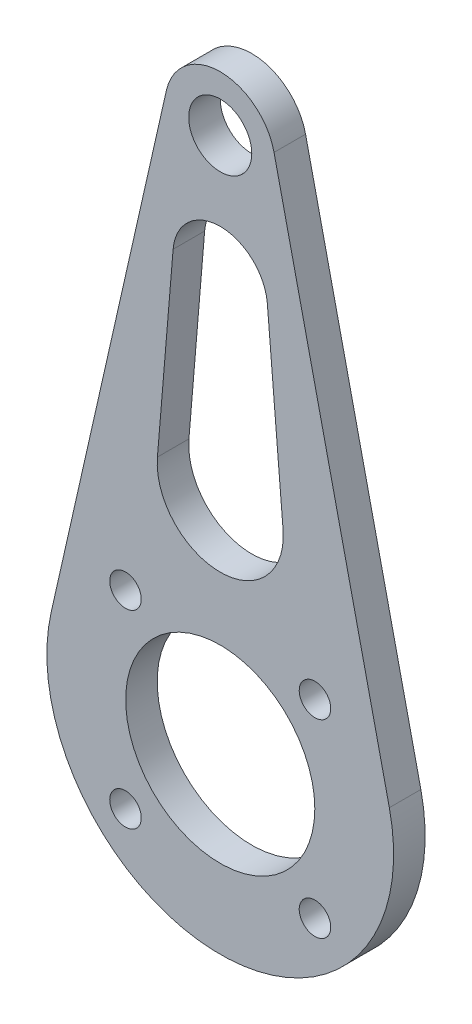
ISO-10303-21;
HEADER;
FILE_DESCRIPTION(('STEP AP214'),'2;1');
FILE_NAME('part.step','',(''),(''),'','','');
FILE_SCHEMA(('AUTOMOTIVE_DESIGN { 1 0 10303 214 1 1 1 1 }'));
ENDSEC;
DATA;
#1=APPLICATION_CONTEXT('core data for automotive mechanical design processes');
#2=APPLICATION_PROTOCOL_DEFINITION('international standard','automotive_design',2000,#1);
#3=PRODUCT_CONTEXT('',#1,'mechanical');
#4=PRODUCT('Part','Part','',(#3));
#5=PRODUCT_RELATED_PRODUCT_CATEGORY('part','',(#4));
#6=PRODUCT_DEFINITION_FORMATION('','',#4);
#7=PRODUCT_DEFINITION_CONTEXT('part definition',#1,'design');
#8=PRODUCT_DEFINITION('design','',#6,#7);
#9=PRODUCT_DEFINITION_SHAPE('','',#8);
#10=(LENGTH_UNIT() NAMED_UNIT(*) SI_UNIT(.MILLI.,.METRE.));
#11=(NAMED_UNIT(*) PLANE_ANGLE_UNIT() SI_UNIT($,.RADIAN.));
#12=(NAMED_UNIT(*) SI_UNIT($,.STERADIAN.) SOLID_ANGLE_UNIT());
#13=UNCERTAINTY_MEASURE_WITH_UNIT(LENGTH_MEASURE(1.E-05),#10,'distance_accuracy_value','');
#14=(GEOMETRIC_REPRESENTATION_CONTEXT(3) GLOBAL_UNCERTAINTY_ASSIGNED_CONTEXT((#13)) GLOBAL_UNIT_ASSIGNED_CONTEXT((#10,
#11,#12)) REPRESENTATION_CONTEXT('',''));
#15=CARTESIAN_POINT('',(0.,0.,0.));
#16=DIRECTION('',(0.,0.,1.));
#17=DIRECTION('',(1.,0.,0.));
#18=AXIS2_PLACEMENT_3D('',#15,#16,#17);
#19=CARTESIAN_POINT('',(-0.504931321829133,20.3713015086282,2.));
#20=DIRECTION('',(0.,0.,1.));
#21=DIRECTION('',(1.,0.,0.));
#22=AXIS2_PLACEMENT_3D('',#19,#20,#21);
#23=PLANE('',#22);
#24=CARTESIAN_POINT('',(-6.51533896191475,-19.6391061314575,2.));
#25=DIRECTION('',(0.,0.,1.));
#26=DIRECTION('',(0.,-1.,0.));
#27=AXIS2_PLACEMENT_3D('',#24,#25,#26);
#28=CIRCLE('',#27,0.999999999999995);
#29=CARTESIAN_POINT('',(-6.51533896191474,-20.6391061314575,2.));
#30=VERTEX_POINT('',#29);
#31=EDGE_CURVE('E258',#30,#30,#28,.T.);
#32=ORIENTED_EDGE('',*,*,#31,.F.);
#33=EDGE_LOOP('',(#32));
#34=FACE_BOUND('',#33,.T.);
#35=CARTESIAN_POINT('',(-6.51533896191476,-7.61829085128616,2.));
#36=DIRECTION('',(0.,0.,1.));
#37=DIRECTION('',(-1.,0.,0.));
#38=AXIS2_PLACEMENT_3D('',#35,#36,#37);
#39=CIRCLE('',#38,0.999999999999995);
#40=CARTESIAN_POINT('',(-7.51533896191475,-7.61829085128616,2.));
#41=VERTEX_POINT('',#40);
#42=EDGE_CURVE('E260',#41,#41,#39,.T.);
#43=ORIENTED_EDGE('',*,*,#42,.F.);
#44=EDGE_LOOP('',(#43));
#45=FACE_BOUND('',#44,.T.);
#46=CARTESIAN_POINT('',(5.50547631825653,-7.6182908512862,2.));
#47=DIRECTION('',(0.,0.,1.));
#48=DIRECTION('',(0.,1.,0.));
#49=AXIS2_PLACEMENT_3D('',#46,#47,#48);
#50=CIRCLE('',#49,0.999999999999995);
#51=CARTESIAN_POINT('',(5.50547631825652,-6.61829085128621,2.));
#52=VERTEX_POINT('',#51);
#53=EDGE_CURVE('E266',#52,#52,#50,.T.);
#54=ORIENTED_EDGE('',*,*,#53,.F.);
#55=EDGE_LOOP('',(#54));
#56=FACE_BOUND('',#55,.T.);
#57=CARTESIAN_POINT('',(5.50547631825649,-19.6391061314575,2.));
#58=DIRECTION('',(0.,0.,1.));
#59=DIRECTION('',(1.,0.,0.));
#60=AXIS2_PLACEMENT_3D('',#57,#58,#59);
#61=CIRCLE('',#60,0.999999999999995);
#62=CARTESIAN_POINT('',(6.50547631825649,-19.6391061314575,2.));
#63=VERTEX_POINT('',#62);
#64=EDGE_CURVE('E272',#63,#63,#61,.T.);
#65=ORIENTED_EDGE('',*,*,#64,.F.);
#66=EDGE_LOOP('',(#65));
#67=FACE_BOUND('',#66,.T.);
#68=DIRECTION('',(-0.0833333333333333,0.996521728591783,0.));
#69=VECTOR('',#68,1.);
#70=CARTESIAN_POINT('',(2.48463386394622,12.6213015086282,2.));
#71=LINE('',#70,#69);
#72=CARTESIAN_POINT('',(3.481155592538,0.704634841961488,2.));
#73=VERTEX_POINT('',#72);
#74=CARTESIAN_POINT('',(2.48463386394622,12.6213015086282,2.));
#75=VERTEX_POINT('',#74);
#76=EDGE_CURVE('E106',#73,#75,#71,.T.);
#77=ORIENTED_EDGE('',*,*,#76,.F.);
#78=CARTESIAN_POINT('',(-0.504931321829133,0.371301508628154,2.));
#79=DIRECTION('',(0.,0.,1.));
#80=DIRECTION('',(1.,0.,0.));
#81=AXIS2_PLACEMENT_3D('',#78,#79,#80);
#82=CIRCLE('',#81,4.);
#83=CARTESIAN_POINT('',(-4.49101823619627,0.704634841961488,2.));
#84=VERTEX_POINT('',#83);
#85=EDGE_CURVE('E98',#84,#73,#82,.T.);
#86=ORIENTED_EDGE('',*,*,#85,.F.);
#87=DIRECTION('',(-0.0833333333333335,-0.996521728591783,0.));
#88=VECTOR('',#87,1.);
#89=CARTESIAN_POINT('',(-3.49449650760448,12.6213015086282,2.));
#90=LINE('',#89,#88);
#91=CARTESIAN_POINT('',(-3.49449650760448,12.6213015086282,2.));
#92=VERTEX_POINT('',#91);
#93=EDGE_CURVE('E121',#92,#84,#90,.T.);
#94=ORIENTED_EDGE('',*,*,#93,.F.);
#95=CARTESIAN_POINT('',(-0.504931321829133,12.3713015086282,2.));
#96=DIRECTION('',(0.,0.,1.));
#97=DIRECTION('',(1.,0.,0.));
#98=AXIS2_PLACEMENT_3D('',#95,#96,#97);
#99=CIRCLE('',#98,3.);
#100=EDGE_CURVE('E119',#75,#92,#99,.T.);
#101=ORIENTED_EDGE('',*,*,#100,.F.);
#102=EDGE_LOOP('',(#77,#86,#94,#101));
#103=FACE_BOUND('',#102,.T.);
#104=CARTESIAN_POINT('',(-0.504931321829133,-13.6286984913718,2.));
#105=DIRECTION('',(0.,0.,1.));
#106=DIRECTION('',(1.,0.,0.));
#107=AXIS2_PLACEMENT_3D('',#104,#105,#106);
#108=CIRCLE('',#107,6.);
#109=CARTESIAN_POINT('',(5.49506867817087,-13.6286984913718,2.));
#110=VERTEX_POINT('',#109);
#111=EDGE_CURVE('E137',#110,#110,#108,.T.);
#112=ORIENTED_EDGE('',*,*,#111,.F.);
#113=EDGE_LOOP('',(#112));
#114=FACE_BOUND('',#113,.T.);
#115=CARTESIAN_POINT('',(-0.504931321829133,20.3713015086282,2.));
#116=DIRECTION('',(0.,0.,1.));
#117=DIRECTION('',(1.,0.,0.));
#118=AXIS2_PLACEMENT_3D('',#115,#116,#117);
#119=CIRCLE('',#118,3.5);
#120=CARTESIAN_POINT('',(2.90885326027478,21.1433603321576,2.));
#121=VERTEX_POINT('',#120);
#122=CARTESIAN_POINT('',(-3.91871590393304,21.1433603321576,2.));
#123=VERTEX_POINT('',#122);
#124=EDGE_CURVE('E143',#121,#123,#119,.T.);
#125=ORIENTED_EDGE('',*,*,#124,.T.);
#126=DIRECTION('',(-0.220588235294118,-0.975367023458261,0.));
#127=VECTOR('',#126,1.);
#128=CARTESIAN_POINT('',(-3.91871590393304,21.1433603321576,2.));
#129=LINE('',#128,#127);
#130=CARTESIAN_POINT('',(-11.23396857987,-11.2022279031366,2.));
#131=VERTEX_POINT('',#130);
#132=EDGE_CURVE('E146',#123,#131,#129,.T.);
#133=ORIENTED_EDGE('',*,*,#132,.T.);
#134=CARTESIAN_POINT('',(-0.504931321829133,-13.6286984913718,2.));
#135=DIRECTION('',(0.,0.,1.));
#136=DIRECTION('',(1.,0.,0.));
#137=AXIS2_PLACEMENT_3D('',#134,#135,#136);
#138=CIRCLE('',#137,11.);
#139=CARTESIAN_POINT('',(10.2241059362117,-11.2022279031366,2.));
#140=VERTEX_POINT('',#139);
#141=EDGE_CURVE('E149',#131,#140,#138,.T.);
#142=ORIENTED_EDGE('',*,*,#141,.T.);
#143=DIRECTION('',(-0.220588235294117,0.975367023458261,0.));
#144=VECTOR('',#143,1.);
#145=CARTESIAN_POINT('',(2.90885326027478,21.1433603321576,2.));
#146=LINE('',#145,#144);
#147=EDGE_CURVE('E151',#140,#121,#146,.T.);
#148=ORIENTED_EDGE('',*,*,#147,.T.);
#149=EDGE_LOOP('',(#125,#133,#142,#148));
#150=FACE_BOUND('',#149,.T.);
#151=CARTESIAN_POINT('',(-0.504931321829133,20.3713015086282,2.));
#152=DIRECTION('',(0.,0.,1.));
#153=DIRECTION('',(1.,0.,0.));
#154=AXIS2_PLACEMENT_3D('',#151,#152,#153);
#155=CIRCLE('',#154,2.);
#156=CARTESIAN_POINT('',(1.49506867817087,20.3713015086282,2.));
#157=VERTEX_POINT('',#156);
#158=EDGE_CURVE('E127',#157,#157,#155,.T.);
#159=ORIENTED_EDGE('',*,*,#158,.F.);
#160=EDGE_LOOP('',(#159));
#161=FACE_BOUND('',#160,.T.);
#162=ADVANCED_FACE('F33',(#34,#45,#56,#67,#103,#114,#150,#161),#23,.T.);
#163=CARTESIAN_POINT('',(-0.504931321829133,20.3713015086282,0.));
#164=DIRECTION('',(0.,0.,1.));
#165=DIRECTION('',(1.,0.,0.));
#166=AXIS2_PLACEMENT_3D('',#163,#164,#165);
#167=PLANE('',#166);
#168=CARTESIAN_POINT('',(-6.51533896191475,-19.6391061314575,0.));
#169=DIRECTION('',(0.,0.,1.));
#170=DIRECTION('',(0.,-1.,0.));
#171=AXIS2_PLACEMENT_3D('',#168,#169,#170);
#172=CIRCLE('',#171,0.999999999999995);
#173=CARTESIAN_POINT('',(-6.51533896191474,-20.6391061314575,0.));
#174=VERTEX_POINT('',#173);
#175=EDGE_CURVE('E256',#174,#174,#172,.T.);
#176=ORIENTED_EDGE('',*,*,#175,.T.);
#177=EDGE_LOOP('',(#176));
#178=FACE_BOUND('',#177,.T.);
#179=CARTESIAN_POINT('',(-6.51533896191476,-7.61829085128616,0.));
#180=DIRECTION('',(0.,0.,1.));
#181=DIRECTION('',(-1.,0.,0.));
#182=AXIS2_PLACEMENT_3D('',#179,#180,#181);
#183=CIRCLE('',#182,0.999999999999995);
#184=CARTESIAN_POINT('',(-7.51533896191475,-7.61829085128616,0.));
#185=VERTEX_POINT('',#184);
#186=EDGE_CURVE('E263',#185,#185,#183,.T.);
#187=ORIENTED_EDGE('',*,*,#186,.T.);
#188=EDGE_LOOP('',(#187));
#189=FACE_BOUND('',#188,.T.);
#190=CARTESIAN_POINT('',(5.50547631825653,-7.6182908512862,0.));
#191=DIRECTION('',(0.,0.,1.));
#192=DIRECTION('',(0.,1.,0.));
#193=AXIS2_PLACEMENT_3D('',#190,#191,#192);
#194=CIRCLE('',#193,0.999999999999995);
#195=CARTESIAN_POINT('',(5.50547631825652,-6.61829085128621,0.));
#196=VERTEX_POINT('',#195);
#197=EDGE_CURVE('E269',#196,#196,#194,.T.);
#198=ORIENTED_EDGE('',*,*,#197,.T.);
#199=EDGE_LOOP('',(#198));
#200=FACE_BOUND('',#199,.T.);
#201=CARTESIAN_POINT('',(5.50547631825649,-19.6391061314575,0.));
#202=DIRECTION('',(0.,0.,1.));
#203=DIRECTION('',(1.,0.,0.));
#204=AXIS2_PLACEMENT_3D('',#201,#202,#203);
#205=CIRCLE('',#204,0.999999999999995);
#206=CARTESIAN_POINT('',(6.50547631825649,-19.6391061314575,0.));
#207=VERTEX_POINT('',#206);
#208=EDGE_CURVE('E275',#207,#207,#205,.T.);
#209=ORIENTED_EDGE('',*,*,#208,.T.);
#210=EDGE_LOOP('',(#209));
#211=FACE_BOUND('',#210,.T.);
#212=CARTESIAN_POINT('',(-0.504931321829133,-13.6286984913718,0.));
#213=DIRECTION('',(0.,0.,1.));
#214=DIRECTION('',(1.,0.,0.));
#215=AXIS2_PLACEMENT_3D('',#212,#213,#214);
#216=CIRCLE('',#215,6.);
#217=CARTESIAN_POINT('',(5.49506867817087,-13.6286984913718,0.));
#218=VERTEX_POINT('',#217);
#219=EDGE_CURVE('E114',#218,#218,#216,.T.);
#220=ORIENTED_EDGE('',*,*,#219,.T.);
#221=EDGE_LOOP('',(#220));
#222=FACE_BOUND('',#221,.T.);
#223=CARTESIAN_POINT('',(-0.504931321829133,20.3713015086282,0.));
#224=DIRECTION('',(0.,0.,1.));
#225=DIRECTION('',(1.,0.,0.));
#226=AXIS2_PLACEMENT_3D('',#223,#224,#225);
#227=CIRCLE('',#226,3.5);
#228=CARTESIAN_POINT('',(2.90885326027478,21.1433603321576,0.));
#229=VERTEX_POINT('',#228);
#230=CARTESIAN_POINT('',(-3.91871590393304,21.1433603321576,0.));
#231=VERTEX_POINT('',#230);
#232=EDGE_CURVE('E140',#229,#231,#227,.T.);
#233=ORIENTED_EDGE('',*,*,#232,.F.);
#234=DIRECTION('',(-0.220588235294117,0.975367023458261,0.));
#235=VECTOR('',#234,1.);
#236=CARTESIAN_POINT('',(2.90885326027478,21.1433603321576,0.));
#237=LINE('',#236,#235);
#238=CARTESIAN_POINT('',(10.2241059362117,-11.2022279031366,0.));
#239=VERTEX_POINT('',#238);
#240=EDGE_CURVE('E147',#239,#229,#237,.T.);
#241=ORIENTED_EDGE('',*,*,#240,.F.);
#242=CARTESIAN_POINT('',(-0.504931321829133,-13.6286984913718,0.));
#243=DIRECTION('',(0.,0.,1.));
#244=DIRECTION('',(1.,0.,0.));
#245=AXIS2_PLACEMENT_3D('',#242,#243,#244);
#246=CIRCLE('',#245,11.);
#247=CARTESIAN_POINT('',(-11.23396857987,-11.2022279031366,0.));
#248=VERTEX_POINT('',#247);
#249=EDGE_CURVE('E158',#248,#239,#246,.T.);
#250=ORIENTED_EDGE('',*,*,#249,.F.);
#251=DIRECTION('',(-0.220588235294118,-0.975367023458261,0.));
#252=VECTOR('',#251,1.);
#253=CARTESIAN_POINT('',(-3.91871590393304,21.1433603321576,0.));
#254=LINE('',#253,#252);
#255=EDGE_CURVE('E156',#231,#248,#254,.T.);
#256=ORIENTED_EDGE('',*,*,#255,.F.);
#257=EDGE_LOOP('',(#233,#241,#250,#256));
#258=FACE_BOUND('',#257,.T.);
#259=CARTESIAN_POINT('',(-0.504931321829133,0.371301508628154,0.));
#260=DIRECTION('',(0.,0.,1.));
#261=DIRECTION('',(1.,0.,0.));
#262=AXIS2_PLACEMENT_3D('',#259,#260,#261);
#263=CIRCLE('',#262,4.);
#264=CARTESIAN_POINT('',(-4.49101823619627,0.704634841961489,0.));
#265=VERTEX_POINT('',#264);
#266=CARTESIAN_POINT('',(3.481155592538,0.704634841961488,0.));
#267=VERTEX_POINT('',#266);
#268=EDGE_CURVE('E56',#265,#267,#263,.T.);
#269=ORIENTED_EDGE('',*,*,#268,.T.);
#270=DIRECTION('',(-0.0833333333333333,0.996521728591783,0.));
#271=VECTOR('',#270,1.);
#272=CARTESIAN_POINT('',(2.48463386394622,12.6213015086282,0.));
#273=LINE('',#272,#271);
#274=CARTESIAN_POINT('',(2.48463386394622,12.6213015086282,0.));
#275=VERTEX_POINT('',#274);
#276=EDGE_CURVE('E113',#267,#275,#273,.T.);
#277=ORIENTED_EDGE('',*,*,#276,.T.);
#278=CARTESIAN_POINT('',(-0.504931321829133,12.3713015086282,0.));
#279=DIRECTION('',(0.,0.,1.));
#280=DIRECTION('',(1.,0.,0.));
#281=AXIS2_PLACEMENT_3D('',#278,#279,#280);
#282=CIRCLE('',#281,3.);
#283=CARTESIAN_POINT('',(-3.49449650760448,12.6213015086282,0.));
#284=VERTEX_POINT('',#283);
#285=EDGE_CURVE('E129',#275,#284,#282,.T.);
#286=ORIENTED_EDGE('',*,*,#285,.T.);
#287=DIRECTION('',(-0.0833333333333335,-0.996521728591783,0.));
#288=VECTOR('',#287,1.);
#289=CARTESIAN_POINT('',(-3.49449650760448,12.6213015086282,0.));
#290=LINE('',#289,#288);
#291=EDGE_CURVE('E107',#284,#265,#290,.T.);
#292=ORIENTED_EDGE('',*,*,#291,.T.);
#293=EDGE_LOOP('',(#269,#277,#286,#292));
#294=FACE_BOUND('',#293,.T.);
#295=CARTESIAN_POINT('',(-0.504931321829133,20.3713015086282,0.));
#296=DIRECTION('',(0.,0.,1.));
#297=DIRECTION('',(1.,0.,0.));
#298=AXIS2_PLACEMENT_3D('',#295,#296,#297);
#299=CIRCLE('',#298,2.);
#300=CARTESIAN_POINT('',(1.49506867817087,20.3713015086282,0.));
#301=VERTEX_POINT('',#300);
#302=EDGE_CURVE('E278',#301,#301,#299,.T.);
#303=ORIENTED_EDGE('',*,*,#302,.T.);
#304=EDGE_LOOP('',(#303));
#305=FACE_BOUND('',#304,.T.);
#306=ADVANCED_FACE('F176',(#178,#189,#200,#211,#222,#258,#294,#305),#167,.F.);
#307=CARTESIAN_POINT('',(-0.504931321829133,20.3713015086282,2.));
#308=DIRECTION('',(0.,0.,-1.));
#309=DIRECTION('',(-1.,0.,0.));
#310=AXIS2_PLACEMENT_3D('',#307,#308,#309);
#311=CYLINDRICAL_SURFACE('',#310,3.5);
#312=ORIENTED_EDGE('',*,*,#232,.T.);
#313=DIRECTION('',(0.,0.,-1.));
#314=VECTOR('',#313,1.);
#315=CARTESIAN_POINT('',(-3.91871590393304,21.1433603321576,2.));
#316=LINE('',#315,#314);
#317=EDGE_CURVE('E11',#123,#231,#316,.T.);
#318=ORIENTED_EDGE('',*,*,#317,.F.);
#319=ORIENTED_EDGE('',*,*,#124,.F.);
#320=DIRECTION('',(0.,0.,-1.));
#321=VECTOR('',#320,1.);
#322=CARTESIAN_POINT('',(2.90885326027478,21.1433603321576,2.));
#323=LINE('',#322,#321);
#324=EDGE_CURVE('E153',#121,#229,#323,.T.);
#325=ORIENTED_EDGE('',*,*,#324,.T.);
#326=EDGE_LOOP('',(#312,#318,#319,#325));
#327=FACE_BOUND('',#326,.T.);
#328=ADVANCED_FACE('F35',(#327),#311,.T.);
#329=CARTESIAN_POINT('',(-3.91871590393304,21.1433603321576,2.));
#330=DIRECTION('',(0.975367023458261,-0.220588235294118,0.));
#331=DIRECTION('',(0.220588235294118,0.975367023458261,0.));
#332=AXIS2_PLACEMENT_3D('',#329,#330,#331);
#333=PLANE('',#332);
#334=ORIENTED_EDGE('',*,*,#255,.T.);
#335=DIRECTION('',(0.,0.,-1.));
#336=VECTOR('',#335,1.);
#337=CARTESIAN_POINT('',(-11.23396857987,-11.2022279031366,2.));
#338=LINE('',#337,#336);
#339=EDGE_CURVE('E41',#131,#248,#338,.T.);
#340=ORIENTED_EDGE('',*,*,#339,.F.);
#341=ORIENTED_EDGE('',*,*,#132,.F.);
#342=ORIENTED_EDGE('',*,*,#317,.T.);
#343=EDGE_LOOP('',(#334,#340,#341,#342));
#344=FACE_BOUND('',#343,.T.);
#345=ADVANCED_FACE('F187',(#344),#333,.F.);
#346=CARTESIAN_POINT('',(-0.504931321829133,-13.6286984913718,2.));
#347=DIRECTION('',(0.,0.,-1.));
#348=DIRECTION('',(-1.,0.,0.));
#349=AXIS2_PLACEMENT_3D('',#346,#347,#348);
#350=CYLINDRICAL_SURFACE('',#349,11.);
#351=ORIENTED_EDGE('',*,*,#249,.T.);
#352=DIRECTION('',(0.,0.,-1.));
#353=VECTOR('',#352,1.);
#354=CARTESIAN_POINT('',(10.2241059362117,-11.2022279031366,2.));
#355=LINE('',#354,#353);
#356=EDGE_CURVE('E163',#140,#239,#355,.T.);
#357=ORIENTED_EDGE('',*,*,#356,.F.);
#358=ORIENTED_EDGE('',*,*,#141,.F.);
#359=ORIENTED_EDGE('',*,*,#339,.T.);
#360=EDGE_LOOP('',(#351,#357,#358,#359));
#361=FACE_BOUND('',#360,.T.);
#362=ADVANCED_FACE('F170',(#361),#350,.T.);
#363=CARTESIAN_POINT('',(2.90885326027478,21.1433603321576,2.));
#364=DIRECTION('',(-0.975367023458261,-0.220588235294117,0.));
#365=DIRECTION('',(0.220588235294117,-0.975367023458261,0.));
#366=AXIS2_PLACEMENT_3D('',#363,#364,#365);
#367=PLANE('',#366);
#368=ORIENTED_EDGE('',*,*,#240,.T.);
#369=ORIENTED_EDGE('',*,*,#324,.F.);
#370=ORIENTED_EDGE('',*,*,#147,.F.);
#371=ORIENTED_EDGE('',*,*,#356,.T.);
#372=EDGE_LOOP('',(#368,#369,#370,#371));
#373=FACE_BOUND('',#372,.T.);
#374=ADVANCED_FACE('F180',(#373),#367,.F.);
#375=CARTESIAN_POINT('',(-0.504931321829133,-13.6286984913718,2.));
#376=DIRECTION('',(0.,0.,-1.));
#377=DIRECTION('',(-1.,0.,0.));
#378=AXIS2_PLACEMENT_3D('',#375,#376,#377);
#379=CYLINDRICAL_SURFACE('',#378,6.);
#380=ORIENTED_EDGE('',*,*,#111,.T.);
#381=EDGE_LOOP('',(#380));
#382=FACE_BOUND('',#381,.T.);
#383=ORIENTED_EDGE('',*,*,#219,.F.);
#384=EDGE_LOOP('',(#383));
#385=FACE_BOUND('',#384,.T.);
#386=ADVANCED_FACE('F205',(#382,#385),#379,.F.);
#387=CARTESIAN_POINT('',(-0.504931321829133,0.371301508628154,2.));
#388=DIRECTION('',(0.,0.,-1.));
#389=DIRECTION('',(-1.,0.,0.));
#390=AXIS2_PLACEMENT_3D('',#387,#388,#389);
#391=CYLINDRICAL_SURFACE('',#390,4.);
#392=ORIENTED_EDGE('',*,*,#268,.F.);
#393=DIRECTION('',(0.,0.,-1.));
#394=VECTOR('',#393,1.);
#395=CARTESIAN_POINT('',(-4.49101823619627,0.704634841961488,2.));
#396=LINE('',#395,#394);
#397=EDGE_CURVE('E102',#84,#265,#396,.T.);
#398=ORIENTED_EDGE('',*,*,#397,.F.);
#399=ORIENTED_EDGE('',*,*,#85,.T.);
#400=DIRECTION('',(0.,0.,-1.));
#401=VECTOR('',#400,1.);
#402=CARTESIAN_POINT('',(3.481155592538,0.704634841961488,2.));
#403=LINE('',#402,#401);
#404=EDGE_CURVE('E101',#73,#267,#403,.T.);
#405=ORIENTED_EDGE('',*,*,#404,.T.);
#406=EDGE_LOOP('',(#392,#398,#399,#405));
#407=FACE_BOUND('',#406,.T.);
#408=ADVANCED_FACE('F100',(#407),#391,.F.);
#409=CARTESIAN_POINT('',(2.48463386394622,12.6213015086282,2.));
#410=DIRECTION('',(-0.996521728591783,-0.0833333333333333,0.));
#411=DIRECTION('',(0.0833333333333333,-0.996521728591783,0.));
#412=AXIS2_PLACEMENT_3D('',#409,#410,#411);
#413=PLANE('',#412);
#414=ORIENTED_EDGE('',*,*,#276,.F.);
#415=ORIENTED_EDGE('',*,*,#404,.F.);
#416=ORIENTED_EDGE('',*,*,#76,.T.);
#417=DIRECTION('',(0.,0.,-1.));
#418=VECTOR('',#417,1.);
#419=CARTESIAN_POINT('',(2.48463386394622,12.6213015086282,2.));
#420=LINE('',#419,#418);
#421=EDGE_CURVE('E115',#75,#275,#420,.T.);
#422=ORIENTED_EDGE('',*,*,#421,.T.);
#423=EDGE_LOOP('',(#414,#415,#416,#422));
#424=FACE_BOUND('',#423,.T.);
#425=ADVANCED_FACE('F110',(#424),#413,.T.);
#426=CARTESIAN_POINT('',(-0.504931321829133,12.3713015086282,2.));
#427=DIRECTION('',(0.,0.,-1.));
#428=DIRECTION('',(-1.,0.,0.));
#429=AXIS2_PLACEMENT_3D('',#426,#427,#428);
#430=CYLINDRICAL_SURFACE('',#429,3.);
#431=ORIENTED_EDGE('',*,*,#285,.F.);
#432=ORIENTED_EDGE('',*,*,#421,.F.);
#433=ORIENTED_EDGE('',*,*,#100,.T.);
#434=DIRECTION('',(0.,0.,-1.));
#435=VECTOR('',#434,1.);
#436=CARTESIAN_POINT('',(-3.49449650760448,12.6213015086282,2.));
#437=LINE('',#436,#435);
#438=EDGE_CURVE('E48',#92,#284,#437,.T.);
#439=ORIENTED_EDGE('',*,*,#438,.T.);
#440=EDGE_LOOP('',(#431,#432,#433,#439));
#441=FACE_BOUND('',#440,.T.);
#442=ADVANCED_FACE('F223',(#441),#430,.F.);
#443=CARTESIAN_POINT('',(-3.49449650760448,12.6213015086282,2.));
#444=DIRECTION('',(0.996521728591783,-0.0833333333333335,0.));
#445=DIRECTION('',(0.0833333333333335,0.996521728591783,0.));
#446=AXIS2_PLACEMENT_3D('',#443,#444,#445);
#447=PLANE('',#446);
#448=ORIENTED_EDGE('',*,*,#291,.F.);
#449=ORIENTED_EDGE('',*,*,#438,.F.);
#450=ORIENTED_EDGE('',*,*,#93,.T.);
#451=ORIENTED_EDGE('',*,*,#397,.T.);
#452=EDGE_LOOP('',(#448,#449,#450,#451));
#453=FACE_BOUND('',#452,.T.);
#454=ADVANCED_FACE('F228',(#453),#447,.T.);
#455=CARTESIAN_POINT('',(-0.504931321829133,20.3713015086282,2.));
#456=DIRECTION('',(0.,0.,-1.));
#457=DIRECTION('',(-1.,0.,0.));
#458=AXIS2_PLACEMENT_3D('',#455,#456,#457);
#459=CYLINDRICAL_SURFACE('',#458,2.);
#460=ORIENTED_EDGE('',*,*,#158,.T.);
#461=EDGE_LOOP('',(#460));
#462=FACE_BOUND('',#461,.T.);
#463=ORIENTED_EDGE('',*,*,#302,.F.);
#464=EDGE_LOOP('',(#463));
#465=FACE_BOUND('',#464,.T.);
#466=ADVANCED_FACE('F232',(#462,#465),#459,.F.);
#467=CARTESIAN_POINT('',(5.50547631825649,-19.6391061314575,0.));
#468=DIRECTION('',(0.,0.,1.));
#469=DIRECTION('',(1.,0.,0.));
#470=AXIS2_PLACEMENT_3D('',#467,#468,#469);
#471=CYLINDRICAL_SURFACE('',#470,0.999999999999995);
#472=ORIENTED_EDGE('',*,*,#208,.F.);
#473=EDGE_LOOP('',(#472));
#474=FACE_BOUND('',#473,.T.);
#475=ORIENTED_EDGE('',*,*,#64,.T.);
#476=EDGE_LOOP('',(#475));
#477=FACE_BOUND('',#476,.T.);
#478=ADVANCED_FACE('F235',(#474,#477),#471,.F.);
#479=CARTESIAN_POINT('',(5.50547631825653,-7.6182908512862,0.));
#480=DIRECTION('',(0.,0.,1.));
#481=DIRECTION('',(1.,0.,0.));
#482=AXIS2_PLACEMENT_3D('',#479,#480,#481);
#483=CYLINDRICAL_SURFACE('',#482,0.999999999999995);
#484=ORIENTED_EDGE('',*,*,#197,.F.);
#485=EDGE_LOOP('',(#484));
#486=FACE_BOUND('',#485,.T.);
#487=ORIENTED_EDGE('',*,*,#53,.T.);
#488=EDGE_LOOP('',(#487));
#489=FACE_BOUND('',#488,.T.);
#490=ADVANCED_FACE('F239',(#486,#489),#483,.F.);
#491=CARTESIAN_POINT('',(-6.51533896191476,-7.61829085128616,0.));
#492=DIRECTION('',(0.,0.,1.));
#493=DIRECTION('',(1.,0.,0.));
#494=AXIS2_PLACEMENT_3D('',#491,#492,#493);
#495=CYLINDRICAL_SURFACE('',#494,0.999999999999995);
#496=ORIENTED_EDGE('',*,*,#186,.F.);
#497=EDGE_LOOP('',(#496));
#498=FACE_BOUND('',#497,.T.);
#499=ORIENTED_EDGE('',*,*,#42,.T.);
#500=EDGE_LOOP('',(#499));
#501=FACE_BOUND('',#500,.T.);
#502=ADVANCED_FACE('F243',(#498,#501),#495,.F.);
#503=CARTESIAN_POINT('',(-6.51533896191475,-19.6391061314575,0.));
#504=DIRECTION('',(0.,0.,1.));
#505=DIRECTION('',(1.,0.,0.));
#506=AXIS2_PLACEMENT_3D('',#503,#504,#505);
#507=CYLINDRICAL_SURFACE('',#506,0.999999999999995);
#508=ORIENTED_EDGE('',*,*,#175,.F.);
#509=EDGE_LOOP('',(#508));
#510=FACE_BOUND('',#509,.T.);
#511=ORIENTED_EDGE('',*,*,#31,.T.);
#512=EDGE_LOOP('',(#511));
#513=FACE_BOUND('',#512,.T.);
#514=ADVANCED_FACE('F247',(#510,#513),#507,.F.);
#515=CLOSED_SHELL('',(#162,#306,#328,#345,#362,#374,#386,#408,#425,#442,#454,#466,#478,#490,
#502,#514));
#516=MANIFOLD_SOLID_BREP('B2',#515);
#517=ADVANCED_BREP_SHAPE_REPRESENTATION('',(#18,#516),#14);
#518=SHAPE_DEFINITION_REPRESENTATION(#9,#517);
ENDSEC;
END-ISO-10303-21;
